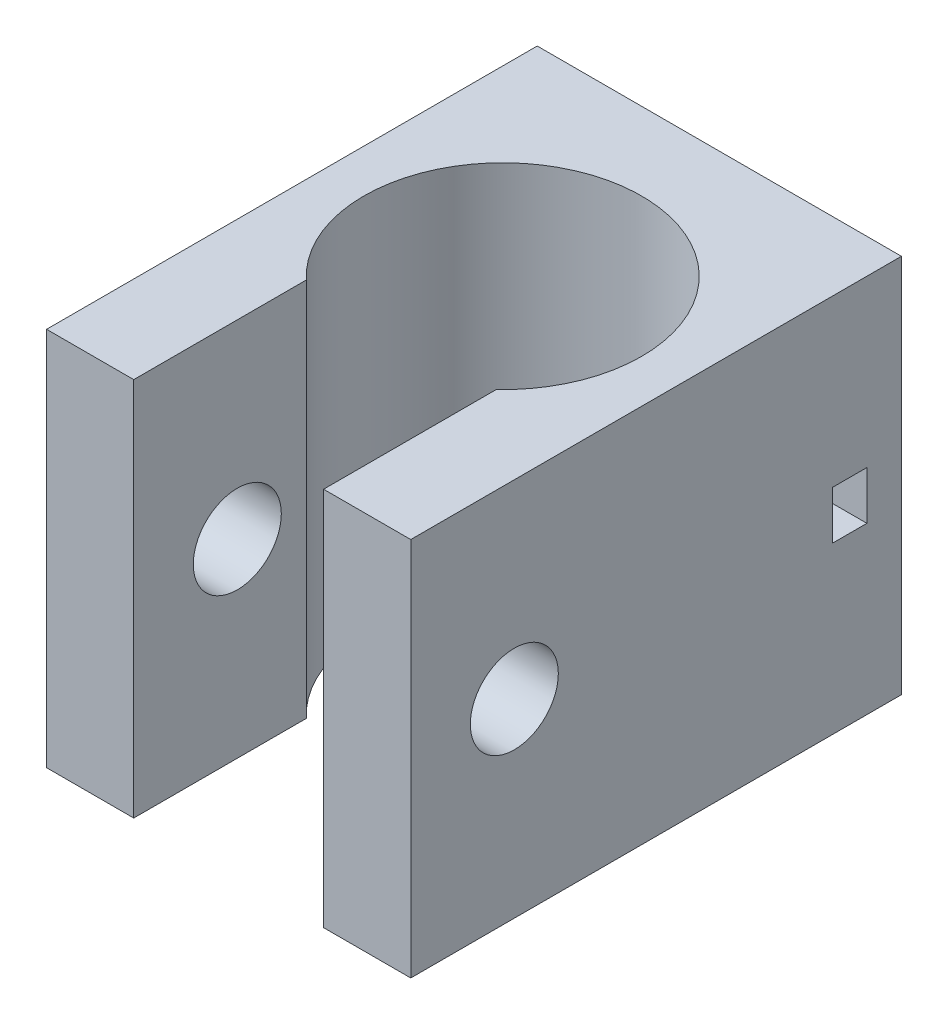
ISO-10303-21;
HEADER;
FILE_DESCRIPTION(('STEP AP214'),'2;1');
FILE_NAME('part.step','',(''),(''),'','','');
FILE_SCHEMA(('AUTOMOTIVE_DESIGN { 1 0 10303 214 1 1 1 1 }'));
ENDSEC;
DATA;
#1=APPLICATION_CONTEXT('core data for automotive mechanical design processes');
#2=APPLICATION_PROTOCOL_DEFINITION('international standard','automotive_design',2000,#1);
#3=PRODUCT_CONTEXT('',#1,'mechanical');
#4=PRODUCT('Part','Part','',(#3));
#5=PRODUCT_RELATED_PRODUCT_CATEGORY('part','',(#4));
#6=PRODUCT_DEFINITION_FORMATION('','',#4);
#7=PRODUCT_DEFINITION_CONTEXT('part definition',#1,'design');
#8=PRODUCT_DEFINITION('design','',#6,#7);
#9=PRODUCT_DEFINITION_SHAPE('','',#8);
#10=(LENGTH_UNIT() NAMED_UNIT(*) SI_UNIT(.MILLI.,.METRE.));
#11=(NAMED_UNIT(*) PLANE_ANGLE_UNIT() SI_UNIT($,.RADIAN.));
#12=(NAMED_UNIT(*) SI_UNIT($,.STERADIAN.) SOLID_ANGLE_UNIT());
#13=UNCERTAINTY_MEASURE_WITH_UNIT(LENGTH_MEASURE(1.E-05),#10,'distance_accuracy_value','');
#14=(GEOMETRIC_REPRESENTATION_CONTEXT(3) GLOBAL_UNCERTAINTY_ASSIGNED_CONTEXT((#13)) GLOBAL_UNIT_ASSIGNED_CONTEXT((#10,
#11,#12)) REPRESENTATION_CONTEXT('',''));
#15=CARTESIAN_POINT('',(0.,0.,0.));
#16=DIRECTION('',(0.,0.,1.));
#17=DIRECTION('',(1.,0.,0.));
#18=AXIS2_PLACEMENT_3D('',#15,#16,#17);
#19=CARTESIAN_POINT('',(-5.49999999999999,11.,15.));
#20=DIRECTION('',(-1.,0.,0.));
#21=DIRECTION('',(0.,0.,1.));
#22=AXIS2_PLACEMENT_3D('',#19,#20,#21);
#23=PLANE('',#22);
#24=CARTESIAN_POINT('',(-5.49999999999999,0.,9.));
#25=DIRECTION('',(-1.,0.,0.));
#26=DIRECTION('',(0.,0.,1.));
#27=AXIS2_PLACEMENT_3D('',#24,#25,#26);
#28=CIRCLE('',#27,2.55);
#29=CARTESIAN_POINT('',(-5.49999999999999,0.,11.55));
#30=VERTEX_POINT('',#29);
#31=EDGE_CURVE('E321',#30,#30,#28,.T.);
#32=ORIENTED_EDGE('',*,*,#31,.T.);
#33=EDGE_LOOP('',(#32));
#34=FACE_BOUND('',#33,.T.);
#35=DIRECTION('',(0.,0.,-1.));
#36=VECTOR('',#35,1.);
#37=CARTESIAN_POINT('',(-5.49999999999999,-11.,15.));
#38=LINE('',#37,#36);
#39=CARTESIAN_POINT('',(-5.49999999999999,-11.,15.));
#40=VERTEX_POINT('',#39);
#41=CARTESIAN_POINT('',(-5.49999999999999,-11.,5.));
#42=VERTEX_POINT('',#41);
#43=EDGE_CURVE('E325',#40,#42,#38,.T.);
#44=ORIENTED_EDGE('',*,*,#43,.T.);
#45=DIRECTION('',(0.,-1.,0.));
#46=VECTOR('',#45,1.);
#47=CARTESIAN_POINT('',(-5.49999999999999,11.,5.));
#48=LINE('',#47,#46);
#49=CARTESIAN_POINT('',(-5.49999999999999,11.,5.));
#50=VERTEX_POINT('',#49);
#51=EDGE_CURVE('E11',#50,#42,#48,.T.);
#52=ORIENTED_EDGE('',*,*,#51,.F.);
#53=DIRECTION('',(0.,0.,-1.));
#54=VECTOR('',#53,1.);
#55=CARTESIAN_POINT('',(-5.49999999999999,11.,15.));
#56=LINE('',#55,#54);
#57=CARTESIAN_POINT('',(-5.49999999999999,11.,15.));
#58=VERTEX_POINT('',#57);
#59=EDGE_CURVE('E326',#58,#50,#56,.T.);
#60=ORIENTED_EDGE('',*,*,#59,.F.);
#61=DIRECTION('',(0.,-1.,0.));
#62=VECTOR('',#61,1.);
#63=CARTESIAN_POINT('',(-5.49999999999999,11.,15.));
#64=LINE('',#63,#62);
#65=EDGE_CURVE('E352',#58,#40,#64,.T.);
#66=ORIENTED_EDGE('',*,*,#65,.T.);
#67=EDGE_LOOP('',(#44,#52,#60,#66));
#68=FACE_BOUND('',#67,.T.);
#69=ADVANCED_FACE('F39',(#34,#68),#23,.F.);
#70=CARTESIAN_POINT('',(0.,11.,-0.878137460114387));
#71=DIRECTION('',(0.,-1.,0.));
#72=DIRECTION('',(0.,0.,-1.));
#73=AXIS2_PLACEMENT_3D('',#70,#71,#72);
#74=CYLINDRICAL_SURFACE('',#73,8.05);
#75=CARTESIAN_POINT('',(0.,-11.,-0.878137460114387));
#76=DIRECTION('',(0.,-1.,0.));
#77=DIRECTION('',(0.,0.,-1.));
#78=AXIS2_PLACEMENT_3D('',#75,#76,#77);
#79=CIRCLE('',#78,8.05);
#80=CARTESIAN_POINT('',(5.50000000000001,-11.,5.));
#81=VERTEX_POINT('',#80);
#82=EDGE_CURVE('E356',#42,#81,#79,.T.);
#83=ORIENTED_EDGE('',*,*,#82,.T.);
#84=DIRECTION('',(0.,-1.,0.));
#85=VECTOR('',#84,1.);
#86=CARTESIAN_POINT('',(5.50000000000001,11.,5.));
#87=LINE('',#86,#85);
#88=CARTESIAN_POINT('',(5.50000000000001,11.,5.));
#89=VERTEX_POINT('',#88);
#90=EDGE_CURVE('E47',#89,#81,#87,.T.);
#91=ORIENTED_EDGE('',*,*,#90,.F.);
#92=CARTESIAN_POINT('',(0.,11.,-0.878137460114387));
#93=DIRECTION('',(0.,-1.,0.));
#94=DIRECTION('',(0.,0.,-1.));
#95=AXIS2_PLACEMENT_3D('',#92,#93,#94);
#96=CIRCLE('',#95,8.05);
#97=EDGE_CURVE('E330',#50,#89,#96,.T.);
#98=ORIENTED_EDGE('',*,*,#97,.F.);
#99=ORIENTED_EDGE('',*,*,#51,.T.);
#100=EDGE_LOOP('',(#83,#91,#98,#99));
#101=FACE_BOUND('',#100,.T.);
#102=ADVANCED_FACE('F427',(#101),#74,.F.);
#103=CARTESIAN_POINT('',(5.50000000000001,11.,15.));
#104=DIRECTION('',(1.,0.,0.));
#105=DIRECTION('',(0.,0.,-1.));
#106=AXIS2_PLACEMENT_3D('',#103,#104,#105);
#107=PLANE('',#106);
#108=CARTESIAN_POINT('',(5.50000000000001,0.,8.99999999999999));
#109=DIRECTION('',(1.,0.,0.));
#110=DIRECTION('',(0.,0.,-1.));
#111=AXIS2_PLACEMENT_3D('',#108,#109,#110);
#112=CIRCLE('',#111,2.55);
#113=CARTESIAN_POINT('',(5.50000000000001,0.,6.44999999999999));
#114=VERTEX_POINT('',#113);
#115=EDGE_CURVE('E317',#114,#114,#112,.T.);
#116=ORIENTED_EDGE('',*,*,#115,.T.);
#117=EDGE_LOOP('',(#116));
#118=FACE_BOUND('',#117,.T.);
#119=DIRECTION('',(0.,0.,1.));
#120=VECTOR('',#119,1.);
#121=CARTESIAN_POINT('',(5.50000000000001,-11.,15.));
#122=LINE('',#121,#120);
#123=CARTESIAN_POINT('',(5.50000000000001,-11.,15.));
#124=VERTEX_POINT('',#123);
#125=EDGE_CURVE('E359',#81,#124,#122,.T.);
#126=ORIENTED_EDGE('',*,*,#125,.T.);
#127=DIRECTION('',(0.,-1.,0.));
#128=VECTOR('',#127,1.);
#129=CARTESIAN_POINT('',(5.50000000000001,11.,15.));
#130=LINE('',#129,#128);
#131=CARTESIAN_POINT('',(5.50000000000001,11.,15.));
#132=VERTEX_POINT('',#131);
#133=EDGE_CURVE('E395',#132,#124,#130,.T.);
#134=ORIENTED_EDGE('',*,*,#133,.F.);
#135=DIRECTION('',(0.,0.,1.));
#136=VECTOR('',#135,1.);
#137=CARTESIAN_POINT('',(5.50000000000001,11.,15.));
#138=LINE('',#137,#136);
#139=EDGE_CURVE('E334',#89,#132,#138,.T.);
#140=ORIENTED_EDGE('',*,*,#139,.F.);
#141=ORIENTED_EDGE('',*,*,#90,.T.);
#142=EDGE_LOOP('',(#126,#134,#140,#141));
#143=FACE_BOUND('',#142,.T.);
#144=ADVANCED_FACE('F404',(#118,#143),#107,.F.);
#145=CARTESIAN_POINT('',(10.55,11.,15.));
#146=DIRECTION('',(0.,0.,-1.));
#147=DIRECTION('',(-1.,0.,0.));
#148=AXIS2_PLACEMENT_3D('',#145,#146,#147);
#149=PLANE('',#148);
#150=DIRECTION('',(1.,0.,0.));
#151=VECTOR('',#150,1.);
#152=CARTESIAN_POINT('',(10.55,-11.,15.));
#153=LINE('',#152,#151);
#154=CARTESIAN_POINT('',(10.55,-11.,15.));
#155=VERTEX_POINT('',#154);
#156=EDGE_CURVE('E362',#124,#155,#153,.T.);
#157=ORIENTED_EDGE('',*,*,#156,.T.);
#158=DIRECTION('',(0.,-1.,0.));
#159=VECTOR('',#158,1.);
#160=CARTESIAN_POINT('',(10.55,11.,15.));
#161=LINE('',#160,#159);
#162=CARTESIAN_POINT('',(10.55,11.,15.));
#163=VERTEX_POINT('',#162);
#164=EDGE_CURVE('E391',#163,#155,#161,.T.);
#165=ORIENTED_EDGE('',*,*,#164,.F.);
#166=DIRECTION('',(1.,0.,0.));
#167=VECTOR('',#166,1.);
#168=CARTESIAN_POINT('',(10.55,11.,15.));
#169=LINE('',#168,#167);
#170=EDGE_CURVE('E337',#132,#163,#169,.T.);
#171=ORIENTED_EDGE('',*,*,#170,.F.);
#172=ORIENTED_EDGE('',*,*,#133,.T.);
#173=EDGE_LOOP('',(#157,#165,#171,#172));
#174=FACE_BOUND('',#173,.T.);
#175=ADVANCED_FACE('F415',(#174),#149,.F.);
#176=CARTESIAN_POINT('',(10.55,11.,-13.4281374601144));
#177=DIRECTION('',(-1.,0.,0.));
#178=DIRECTION('',(0.,0.,1.));
#179=AXIS2_PLACEMENT_3D('',#176,#177,#178);
#180=PLANE('',#179);
#181=DIRECTION('',(0.,0.,-1.));
#182=VECTOR('',#181,1.);
#183=CARTESIAN_POINT('',(10.55,-1.4,-9.42813746011439));
#184=LINE('',#183,#182);
#185=CARTESIAN_POINT('',(10.55,-1.4,-9.42813746011438));
#186=VERTEX_POINT('',#185);
#187=CARTESIAN_POINT('',(10.55,-1.4,-11.4281374601144));
#188=VERTEX_POINT('',#187);
#189=EDGE_CURVE('E283',#186,#188,#184,.T.);
#190=ORIENTED_EDGE('',*,*,#189,.F.);
#191=DIRECTION('',(0.,-1.,0.));
#192=VECTOR('',#191,1.);
#193=CARTESIAN_POINT('',(10.55,1.4,-9.42813746011439));
#194=LINE('',#193,#192);
#195=CARTESIAN_POINT('',(10.55,1.4,-9.42813746011439));
#196=VERTEX_POINT('',#195);
#197=EDGE_CURVE('E222',#196,#186,#194,.T.);
#198=ORIENTED_EDGE('',*,*,#197,.F.);
#199=DIRECTION('',(0.,0.,1.));
#200=VECTOR('',#199,1.);
#201=CARTESIAN_POINT('',(10.55,1.4,-9.42813746011439));
#202=LINE('',#201,#200);
#203=CARTESIAN_POINT('',(10.55,1.4,-11.4281374601144));
#204=VERTEX_POINT('',#203);
#205=EDGE_CURVE('E291',#204,#196,#202,.T.);
#206=ORIENTED_EDGE('',*,*,#205,.F.);
#207=DIRECTION('',(0.,1.,0.));
#208=VECTOR('',#207,1.);
#209=CARTESIAN_POINT('',(10.55,1.4,-11.4281374601144));
#210=LINE('',#209,#208);
#211=EDGE_CURVE('E287',#188,#204,#210,.T.);
#212=ORIENTED_EDGE('',*,*,#211,.F.);
#213=EDGE_LOOP('',(#190,#198,#206,#212));
#214=FACE_BOUND('',#213,.T.);
#215=CARTESIAN_POINT('',(10.55,0.,8.99999999999999));
#216=DIRECTION('',(1.,0.,0.));
#217=DIRECTION('',(0.,0.,-1.));
#218=AXIS2_PLACEMENT_3D('',#215,#216,#217);
#219=CIRCLE('',#218,2.55);
#220=CARTESIAN_POINT('',(10.55,0.,6.44999999999999));
#221=VERTEX_POINT('',#220);
#222=EDGE_CURVE('E309',#221,#221,#219,.T.);
#223=ORIENTED_EDGE('',*,*,#222,.F.);
#224=EDGE_LOOP('',(#223));
#225=FACE_BOUND('',#224,.T.);
#226=DIRECTION('',(0.,0.,-1.));
#227=VECTOR('',#226,1.);
#228=CARTESIAN_POINT('',(10.55,-11.,-13.4281374601144));
#229=LINE('',#228,#227);
#230=CARTESIAN_POINT('',(10.55,-11.,-13.4281374601144));
#231=VERTEX_POINT('',#230);
#232=EDGE_CURVE('E365',#155,#231,#229,.T.);
#233=ORIENTED_EDGE('',*,*,#232,.T.);
#234=DIRECTION('',(0.,-1.,0.));
#235=VECTOR('',#234,1.);
#236=CARTESIAN_POINT('',(10.55,11.,-13.4281374601144));
#237=LINE('',#236,#235);
#238=CARTESIAN_POINT('',(10.55,11.,-13.4281374601144));
#239=VERTEX_POINT('',#238);
#240=EDGE_CURVE('E387',#239,#231,#237,.T.);
#241=ORIENTED_EDGE('',*,*,#240,.F.);
#242=DIRECTION('',(0.,0.,-1.));
#243=VECTOR('',#242,1.);
#244=CARTESIAN_POINT('',(10.55,11.,-13.4281374601144));
#245=LINE('',#244,#243);
#246=EDGE_CURVE('E340',#163,#239,#245,.T.);
#247=ORIENTED_EDGE('',*,*,#246,.F.);
#248=ORIENTED_EDGE('',*,*,#164,.T.);
#249=EDGE_LOOP('',(#233,#241,#247,#248));
#250=FACE_BOUND('',#249,.T.);
#251=ADVANCED_FACE('F419',(#214,#225,#250),#180,.F.);
#252=CARTESIAN_POINT('',(-10.55,11.,-13.4281374601144));
#253=DIRECTION('',(0.,0.,1.));
#254=DIRECTION('',(1.,0.,0.));
#255=AXIS2_PLACEMENT_3D('',#252,#253,#254);
#256=PLANE('',#255);
#257=DIRECTION('',(-1.,0.,0.));
#258=VECTOR('',#257,1.);
#259=CARTESIAN_POINT('',(2.50000000000001,3.5,-13.4281374601144));
#260=LINE('',#259,#258);
#261=CARTESIAN_POINT('',(2.50000000000001,3.5,-13.4281374601144));
#262=VERTEX_POINT('',#261);
#263=CARTESIAN_POINT('',(-2.49999999999999,3.5,-13.4281374601144));
#264=VERTEX_POINT('',#263);
#265=EDGE_CURVE('E212',#262,#264,#260,.T.);
#266=ORIENTED_EDGE('',*,*,#265,.F.);
#267=DIRECTION('',(0.,-1.,0.));
#268=VECTOR('',#267,1.);
#269=CARTESIAN_POINT('',(2.50000000000001,8.5,-13.4281374601144));
#270=LINE('',#269,#268);
#271=CARTESIAN_POINT('',(2.50000000000001,8.5,-13.4281374601144));
#272=VERTEX_POINT('',#271);
#273=EDGE_CURVE('E54',#272,#262,#270,.T.);
#274=ORIENTED_EDGE('',*,*,#273,.F.);
#275=DIRECTION('',(1.,0.,0.));
#276=VECTOR('',#275,1.);
#277=CARTESIAN_POINT('',(2.50000000000001,8.5,-13.4281374601144));
#278=LINE('',#277,#276);
#279=CARTESIAN_POINT('',(-2.49999999999999,8.5,-13.4281374601144));
#280=VERTEX_POINT('',#279);
#281=EDGE_CURVE('E199',#280,#272,#278,.T.);
#282=ORIENTED_EDGE('',*,*,#281,.F.);
#283=DIRECTION('',(0.,1.,0.));
#284=VECTOR('',#283,1.);
#285=CARTESIAN_POINT('',(-2.49999999999999,8.5,-13.4281374601144));
#286=LINE('',#285,#284);
#287=EDGE_CURVE('E203',#264,#280,#286,.T.);
#288=ORIENTED_EDGE('',*,*,#287,.F.);
#289=EDGE_LOOP('',(#266,#274,#282,#288));
#290=FACE_BOUND('',#289,.T.);
#291=DIRECTION('',(1.,0.,0.));
#292=VECTOR('',#291,1.);
#293=CARTESIAN_POINT('',(-2.49999999999999,-3.5,-13.4281374601144));
#294=LINE('',#293,#292);
#295=CARTESIAN_POINT('',(-2.49999999999999,-3.5,-13.4281374601144));
#296=VERTEX_POINT('',#295);
#297=CARTESIAN_POINT('',(2.50000000000001,-3.5,-13.4281374601144));
#298=VERTEX_POINT('',#297);
#299=EDGE_CURVE('E248',#296,#298,#294,.T.);
#300=ORIENTED_EDGE('',*,*,#299,.F.);
#301=DIRECTION('',(0.,1.,0.));
#302=VECTOR('',#301,1.);
#303=CARTESIAN_POINT('',(-2.49999999999999,-3.5,-13.4281374601144));
#304=LINE('',#303,#302);
#305=CARTESIAN_POINT('',(-2.49999999999999,-8.5,-13.4281374601144));
#306=VERTEX_POINT('',#305);
#307=EDGE_CURVE('E62',#306,#296,#304,.T.);
#308=ORIENTED_EDGE('',*,*,#307,.F.);
#309=DIRECTION('',(-1.,0.,0.));
#310=VECTOR('',#309,1.);
#311=CARTESIAN_POINT('',(-2.49999999999999,-8.5,-13.4281374601144));
#312=LINE('',#311,#310);
#313=CARTESIAN_POINT('',(2.50000000000001,-8.5,-13.4281374601144));
#314=VERTEX_POINT('',#313);
#315=EDGE_CURVE('E233',#314,#306,#312,.T.);
#316=ORIENTED_EDGE('',*,*,#315,.F.);
#317=DIRECTION('',(0.,-1.,0.));
#318=VECTOR('',#317,1.);
#319=CARTESIAN_POINT('',(2.50000000000001,-3.5,-13.4281374601144));
#320=LINE('',#319,#318);
#321=EDGE_CURVE('E252',#298,#314,#320,.T.);
#322=ORIENTED_EDGE('',*,*,#321,.F.);
#323=EDGE_LOOP('',(#300,#308,#316,#322));
#324=FACE_BOUND('',#323,.T.);
#325=DIRECTION('',(-1.,0.,0.));
#326=VECTOR('',#325,1.);
#327=CARTESIAN_POINT('',(-10.55,-11.,-13.4281374601144));
#328=LINE('',#327,#326);
#329=CARTESIAN_POINT('',(-10.55,-11.,-13.4281374601144));
#330=VERTEX_POINT('',#329);
#331=EDGE_CURVE('E368',#231,#330,#328,.T.);
#332=ORIENTED_EDGE('',*,*,#331,.T.);
#333=DIRECTION('',(0.,-1.,0.));
#334=VECTOR('',#333,1.);
#335=CARTESIAN_POINT('',(-10.55,11.,-13.4281374601144));
#336=LINE('',#335,#334);
#337=CARTESIAN_POINT('',(-10.55,11.,-13.4281374601144));
#338=VERTEX_POINT('',#337);
#339=EDGE_CURVE('E383',#338,#330,#336,.T.);
#340=ORIENTED_EDGE('',*,*,#339,.F.);
#341=DIRECTION('',(-1.,0.,0.));
#342=VECTOR('',#341,1.);
#343=CARTESIAN_POINT('',(-10.55,11.,-13.4281374601144));
#344=LINE('',#343,#342);
#345=EDGE_CURVE('E343',#239,#338,#344,.T.);
#346=ORIENTED_EDGE('',*,*,#345,.F.);
#347=ORIENTED_EDGE('',*,*,#240,.T.);
#348=EDGE_LOOP('',(#332,#340,#346,#347));
#349=FACE_BOUND('',#348,.T.);
#350=ADVANCED_FACE('F440',(#290,#324,#349),#256,.F.);
#351=CARTESIAN_POINT('',(-10.55,11.,15.));
#352=DIRECTION('',(1.,0.,0.));
#353=DIRECTION('',(0.,0.,-1.));
#354=AXIS2_PLACEMENT_3D('',#351,#352,#353);
#355=PLANE('',#354);
#356=DIRECTION('',(0.,0.,-1.));
#357=VECTOR('',#356,1.);
#358=CARTESIAN_POINT('',(-10.55,1.4,-9.42813746011438));
#359=LINE('',#358,#357);
#360=CARTESIAN_POINT('',(-10.55,1.4,-9.42813746011438));
#361=VERTEX_POINT('',#360);
#362=CARTESIAN_POINT('',(-10.55,1.4,-11.4281374601144));
#363=VERTEX_POINT('',#362);
#364=EDGE_CURVE('E273',#361,#363,#359,.T.);
#365=ORIENTED_EDGE('',*,*,#364,.F.);
#366=DIRECTION('',(0.,1.,0.));
#367=VECTOR('',#366,1.);
#368=CARTESIAN_POINT('',(-10.55,1.4,-9.42813746011438));
#369=LINE('',#368,#367);
#370=CARTESIAN_POINT('',(-10.55,-1.4,-9.42813746011438));
#371=VERTEX_POINT('',#370);
#372=EDGE_CURVE('E277',#371,#361,#369,.T.);
#373=ORIENTED_EDGE('',*,*,#372,.F.);
#374=DIRECTION('',(0.,0.,1.));
#375=VECTOR('',#374,1.);
#376=CARTESIAN_POINT('',(-10.55,-1.4,-9.42813746011438));
#377=LINE('',#376,#375);
#378=CARTESIAN_POINT('',(-10.55,-1.4,-11.4281374601144));
#379=VERTEX_POINT('',#378);
#380=EDGE_CURVE('E280',#379,#371,#377,.T.);
#381=ORIENTED_EDGE('',*,*,#380,.F.);
#382=DIRECTION('',(0.,-1.,0.));
#383=VECTOR('',#382,1.);
#384=CARTESIAN_POINT('',(-10.55,1.4,-11.4281374601144));
#385=LINE('',#384,#383);
#386=EDGE_CURVE('E269',#363,#379,#385,.T.);
#387=ORIENTED_EDGE('',*,*,#386,.F.);
#388=EDGE_LOOP('',(#365,#373,#381,#387));
#389=FACE_BOUND('',#388,.T.);
#390=CARTESIAN_POINT('',(-10.55,0.,9.));
#391=DIRECTION('',(1.,0.,0.));
#392=DIRECTION('',(0.,0.,-1.));
#393=AXIS2_PLACEMENT_3D('',#390,#391,#392);
#394=CIRCLE('',#393,2.55);
#395=CARTESIAN_POINT('',(-10.55,0.,6.44999999999999));
#396=VERTEX_POINT('',#395);
#397=EDGE_CURVE('E313',#396,#396,#394,.F.);
#398=ORIENTED_EDGE('',*,*,#397,.F.);
#399=EDGE_LOOP('',(#398));
#400=FACE_BOUND('',#399,.T.);
#401=DIRECTION('',(0.,0.,1.));
#402=VECTOR('',#401,1.);
#403=CARTESIAN_POINT('',(-10.55,-11.,15.));
#404=LINE('',#403,#402);
#405=CARTESIAN_POINT('',(-10.55,-11.,15.));
#406=VERTEX_POINT('',#405);
#407=EDGE_CURVE('E371',#330,#406,#404,.T.);
#408=ORIENTED_EDGE('',*,*,#407,.T.);
#409=DIRECTION('',(0.,-1.,0.));
#410=VECTOR('',#409,1.);
#411=CARTESIAN_POINT('',(-10.55,11.,15.));
#412=LINE('',#411,#410);
#413=CARTESIAN_POINT('',(-10.55,11.,15.));
#414=VERTEX_POINT('',#413);
#415=EDGE_CURVE('E379',#414,#406,#412,.T.);
#416=ORIENTED_EDGE('',*,*,#415,.F.);
#417=DIRECTION('',(0.,0.,1.));
#418=VECTOR('',#417,1.);
#419=CARTESIAN_POINT('',(-10.55,11.,15.));
#420=LINE('',#419,#418);
#421=EDGE_CURVE('E346',#338,#414,#420,.T.);
#422=ORIENTED_EDGE('',*,*,#421,.F.);
#423=ORIENTED_EDGE('',*,*,#339,.T.);
#424=EDGE_LOOP('',(#408,#416,#422,#423));
#425=FACE_BOUND('',#424,.T.);
#426=ADVANCED_FACE('F438',(#389,#400,#425),#355,.F.);
#427=CARTESIAN_POINT('',(-5.49999999999999,11.,15.));
#428=DIRECTION('',(0.,0.,-1.));
#429=DIRECTION('',(-1.,0.,0.));
#430=AXIS2_PLACEMENT_3D('',#427,#428,#429);
#431=PLANE('',#430);
#432=DIRECTION('',(1.,0.,0.));
#433=VECTOR('',#432,1.);
#434=CARTESIAN_POINT('',(-5.49999999999999,-11.,15.));
#435=LINE('',#434,#433);
#436=EDGE_CURVE('E331',#406,#40,#435,.T.);
#437=ORIENTED_EDGE('',*,*,#436,.T.);
#438=ORIENTED_EDGE('',*,*,#65,.F.);
#439=DIRECTION('',(1.,0.,0.));
#440=VECTOR('',#439,1.);
#441=CARTESIAN_POINT('',(-5.49999999999999,11.,15.));
#442=LINE('',#441,#440);
#443=EDGE_CURVE('E349',#414,#58,#442,.T.);
#444=ORIENTED_EDGE('',*,*,#443,.F.);
#445=ORIENTED_EDGE('',*,*,#415,.T.);
#446=EDGE_LOOP('',(#437,#438,#444,#445));
#447=FACE_BOUND('',#446,.T.);
#448=ADVANCED_FACE('F433',(#447),#431,.F.);
#449=CARTESIAN_POINT('',(0.,11.,-0.878137460114387));
#450=DIRECTION('',(0.,-1.,0.));
#451=DIRECTION('',(0.,0.,-1.));
#452=AXIS2_PLACEMENT_3D('',#449,#450,#451);
#453=PLANE('',#452);
#454=ORIENTED_EDGE('',*,*,#59,.T.);
#455=ORIENTED_EDGE('',*,*,#97,.T.);
#456=ORIENTED_EDGE('',*,*,#139,.T.);
#457=ORIENTED_EDGE('',*,*,#170,.T.);
#458=ORIENTED_EDGE('',*,*,#246,.T.);
#459=ORIENTED_EDGE('',*,*,#345,.T.);
#460=ORIENTED_EDGE('',*,*,#421,.T.);
#461=ORIENTED_EDGE('',*,*,#443,.T.);
#462=EDGE_LOOP('',(#454,#455,#456,#457,#458,#459,#460,#461));
#463=FACE_BOUND('',#462,.T.);
#464=ADVANCED_FACE('F423',(#463),#453,.F.);
#465=CARTESIAN_POINT('',(0.,-11.,-0.878137460114387));
#466=DIRECTION('',(0.,-1.,0.));
#467=DIRECTION('',(0.,0.,-1.));
#468=AXIS2_PLACEMENT_3D('',#465,#466,#467);
#469=PLANE('',#468);
#470=ORIENTED_EDGE('',*,*,#43,.F.);
#471=ORIENTED_EDGE('',*,*,#436,.F.);
#472=ORIENTED_EDGE('',*,*,#407,.F.);
#473=ORIENTED_EDGE('',*,*,#331,.F.);
#474=ORIENTED_EDGE('',*,*,#232,.F.);
#475=ORIENTED_EDGE('',*,*,#156,.F.);
#476=ORIENTED_EDGE('',*,*,#125,.F.);
#477=ORIENTED_EDGE('',*,*,#82,.F.);
#478=EDGE_LOOP('',(#470,#471,#472,#473,#474,#475,#476,#477));
#479=FACE_BOUND('',#478,.T.);
#480=ADVANCED_FACE('F410',(#479),#469,.T.);
#481=CARTESIAN_POINT('',(-17.7624891681028,0.,9.));
#482=DIRECTION('',(1.,0.,0.));
#483=DIRECTION('',(0.,0.,-1.));
#484=AXIS2_PLACEMENT_3D('',#481,#482,#483);
#485=CYLINDRICAL_SURFACE('',#484,2.55);
#486=ORIENTED_EDGE('',*,*,#397,.T.);
#487=EDGE_LOOP('',(#486));
#488=FACE_BOUND('',#487,.T.);
#489=ORIENTED_EDGE('',*,*,#31,.F.);
#490=EDGE_LOOP('',(#489));
#491=FACE_BOUND('',#490,.T.);
#492=ADVANCED_FACE('F460',(#488,#491),#485,.F.);
#493=ORIENTED_EDGE('',*,*,#222,.T.);
#494=EDGE_LOOP('',(#493));
#495=FACE_BOUND('',#494,.T.);
#496=ORIENTED_EDGE('',*,*,#115,.F.);
#497=EDGE_LOOP('',(#496));
#498=FACE_BOUND('',#497,.T.);
#499=ADVANCED_FACE('F462',(#495,#498),#485,.F.);
#500=CARTESIAN_POINT('',(-13.990930106817,1.4,-9.42813746011438));
#501=DIRECTION('',(0.,0.,1.));
#502=DIRECTION('',(1.,0.,0.));
#503=AXIS2_PLACEMENT_3D('',#500,#501,#502);
#504=PLANE('',#503);
#505=ORIENTED_EDGE('',*,*,#372,.T.);
#506=DIRECTION('',(1.,0.,0.));
#507=VECTOR('',#506,1.);
#508=CARTESIAN_POINT('',(-13.990930106817,1.4,-9.42813746011438));
#509=LINE('',#508,#507);
#510=EDGE_CURVE('E274',#361,#196,#509,.T.);
#511=ORIENTED_EDGE('',*,*,#510,.T.);
#512=ORIENTED_EDGE('',*,*,#197,.T.);
#513=DIRECTION('',(1.,0.,0.));
#514=VECTOR('',#513,1.);
#515=CARTESIAN_POINT('',(-13.990930106817,-1.4,-9.42813746011438));
#516=LINE('',#515,#514);
#517=EDGE_CURVE('E295',#371,#186,#516,.T.);
#518=ORIENTED_EDGE('',*,*,#517,.F.);
#519=EDGE_LOOP('',(#505,#511,#512,#518));
#520=FACE_BOUND('',#519,.T.);
#521=ADVANCED_FACE('F469',(#520),#504,.F.);
#522=CARTESIAN_POINT('',(-13.990930106817,1.4,-9.42813746011438));
#523=DIRECTION('',(0.,1.,0.));
#524=DIRECTION('',(0.,0.,1.));
#525=AXIS2_PLACEMENT_3D('',#522,#523,#524);
#526=PLANE('',#525);
#527=ORIENTED_EDGE('',*,*,#364,.T.);
#528=DIRECTION('',(1.,0.,0.));
#529=VECTOR('',#528,1.);
#530=CARTESIAN_POINT('',(-13.990930106817,1.4,-11.4281374601144));
#531=LINE('',#530,#529);
#532=EDGE_CURVE('E298',#363,#204,#531,.T.);
#533=ORIENTED_EDGE('',*,*,#532,.T.);
#534=ORIENTED_EDGE('',*,*,#205,.T.);
#535=ORIENTED_EDGE('',*,*,#510,.F.);
#536=EDGE_LOOP('',(#527,#533,#534,#535));
#537=FACE_BOUND('',#536,.T.);
#538=ADVANCED_FACE('F537',(#537),#526,.F.);
#539=CARTESIAN_POINT('',(-13.990930106817,1.4,-11.4281374601144));
#540=DIRECTION('',(0.,0.,-1.));
#541=DIRECTION('',(0.,1.,0.));
#542=AXIS2_PLACEMENT_3D('',#539,#540,#541);
#543=PLANE('',#542);
#544=ORIENTED_EDGE('',*,*,#386,.T.);
#545=DIRECTION('',(1.,0.,0.));
#546=VECTOR('',#545,1.);
#547=CARTESIAN_POINT('',(-13.990930106817,-1.4,-11.4281374601144));
#548=LINE('',#547,#546);
#549=EDGE_CURVE('E301',#379,#188,#548,.T.);
#550=ORIENTED_EDGE('',*,*,#549,.T.);
#551=ORIENTED_EDGE('',*,*,#211,.T.);
#552=ORIENTED_EDGE('',*,*,#532,.F.);
#553=EDGE_LOOP('',(#544,#550,#551,#552));
#554=FACE_BOUND('',#553,.T.);
#555=ADVANCED_FACE('F546',(#554),#543,.F.);
#556=CARTESIAN_POINT('',(-13.990930106817,-1.4,-9.42813746011438));
#557=DIRECTION('',(0.,-1.,0.));
#558=DIRECTION('',(0.,0.,-1.));
#559=AXIS2_PLACEMENT_3D('',#556,#557,#558);
#560=PLANE('',#559);
#561=ORIENTED_EDGE('',*,*,#380,.T.);
#562=ORIENTED_EDGE('',*,*,#517,.T.);
#563=ORIENTED_EDGE('',*,*,#189,.T.);
#564=ORIENTED_EDGE('',*,*,#549,.F.);
#565=EDGE_LOOP('',(#561,#562,#563,#564));
#566=FACE_BOUND('',#565,.T.);
#567=ADVANCED_FACE('F556',(#566),#560,.F.);
#568=CARTESIAN_POINT('',(-2.49999999999999,-3.5,-11.4281374601144));
#569=DIRECTION('',(-1.,0.,0.));
#570=DIRECTION('',(0.,-1.,0.));
#571=AXIS2_PLACEMENT_3D('',#568,#569,#570);
#572=PLANE('',#571);
#573=ORIENTED_EDGE('',*,*,#307,.T.);
#574=DIRECTION('',(0.,0.,-1.));
#575=VECTOR('',#574,1.);
#576=CARTESIAN_POINT('',(-2.49999999999999,-3.5,-11.4281374601144));
#577=LINE('',#576,#575);
#578=CARTESIAN_POINT('',(-2.49999999999999,-3.5,-11.4281374601144));
#579=VERTEX_POINT('',#578);
#580=EDGE_CURVE('E245',#579,#296,#577,.T.);
#581=ORIENTED_EDGE('',*,*,#580,.F.);
#582=DIRECTION('',(0.,1.,0.));
#583=VECTOR('',#582,1.);
#584=CARTESIAN_POINT('',(-2.49999999999999,-3.5,-11.4281374601144));
#585=LINE('',#584,#583);
#586=CARTESIAN_POINT('',(-2.49999999999999,-8.5,-11.4281374601144));
#587=VERTEX_POINT('',#586);
#588=EDGE_CURVE('E228',#587,#579,#585,.T.);
#589=ORIENTED_EDGE('',*,*,#588,.F.);
#590=DIRECTION('',(0.,0.,-1.));
#591=VECTOR('',#590,1.);
#592=CARTESIAN_POINT('',(-2.49999999999999,-8.5,-11.4281374601144));
#593=LINE('',#592,#591);
#594=EDGE_CURVE('E213',#587,#306,#593,.T.);
#595=ORIENTED_EDGE('',*,*,#594,.T.);
#596=EDGE_LOOP('',(#573,#581,#589,#595));
#597=FACE_BOUND('',#596,.T.);
#598=ADVANCED_FACE('F565',(#597),#572,.F.);
#599=CARTESIAN_POINT('',(-2.49999999999999,-8.5,-11.4281374601144));
#600=DIRECTION('',(0.,-1.,0.));
#601=DIRECTION('',(0.,0.,-1.));
#602=AXIS2_PLACEMENT_3D('',#599,#600,#601);
#603=PLANE('',#602);
#604=ORIENTED_EDGE('',*,*,#315,.T.);
#605=ORIENTED_EDGE('',*,*,#594,.F.);
#606=DIRECTION('',(-1.,0.,0.));
#607=VECTOR('',#606,1.);
#608=CARTESIAN_POINT('',(-2.49999999999999,-8.5,-11.4281374601144));
#609=LINE('',#608,#607);
#610=CARTESIAN_POINT('',(2.50000000000001,-8.5,-11.4281374601144));
#611=VERTEX_POINT('',#610);
#612=EDGE_CURVE('E241',#611,#587,#609,.T.);
#613=ORIENTED_EDGE('',*,*,#612,.F.);
#614=DIRECTION('',(0.,0.,-1.));
#615=VECTOR('',#614,1.);
#616=CARTESIAN_POINT('',(2.50000000000001,-8.5,-11.4281374601144));
#617=LINE('',#616,#615);
#618=EDGE_CURVE('E261',#611,#314,#617,.T.);
#619=ORIENTED_EDGE('',*,*,#618,.T.);
#620=EDGE_LOOP('',(#604,#605,#613,#619));
#621=FACE_BOUND('',#620,.T.);
#622=ADVANCED_FACE('F578',(#621),#603,.F.);
#623=CARTESIAN_POINT('',(2.50000000000001,-3.5,-11.4281374601144));
#624=DIRECTION('',(1.,0.,0.));
#625=DIRECTION('',(0.,1.,0.));
#626=AXIS2_PLACEMENT_3D('',#623,#624,#625);
#627=PLANE('',#626);
#628=ORIENTED_EDGE('',*,*,#321,.T.);
#629=ORIENTED_EDGE('',*,*,#618,.F.);
#630=DIRECTION('',(0.,-1.,0.));
#631=VECTOR('',#630,1.);
#632=CARTESIAN_POINT('',(2.50000000000001,-3.5,-11.4281374601144));
#633=LINE('',#632,#631);
#634=CARTESIAN_POINT('',(2.50000000000001,-3.5,-11.4281374601144));
#635=VERTEX_POINT('',#634);
#636=EDGE_CURVE('E237',#635,#611,#633,.T.);
#637=ORIENTED_EDGE('',*,*,#636,.F.);
#638=DIRECTION('',(0.,0.,-1.));
#639=VECTOR('',#638,1.);
#640=CARTESIAN_POINT('',(2.50000000000001,-3.5,-11.4281374601144));
#641=LINE('',#640,#639);
#642=EDGE_CURVE('E264',#635,#298,#641,.T.);
#643=ORIENTED_EDGE('',*,*,#642,.T.);
#644=EDGE_LOOP('',(#628,#629,#637,#643));
#645=FACE_BOUND('',#644,.T.);
#646=ADVANCED_FACE('F587',(#645),#627,.F.);
#647=CARTESIAN_POINT('',(-2.49999999999999,-3.5,-11.4281374601144));
#648=DIRECTION('',(0.,1.,0.));
#649=DIRECTION('',(-1.,0.,0.));
#650=AXIS2_PLACEMENT_3D('',#647,#648,#649);
#651=PLANE('',#650);
#652=ORIENTED_EDGE('',*,*,#299,.T.);
#653=ORIENTED_EDGE('',*,*,#642,.F.);
#654=DIRECTION('',(1.,0.,0.));
#655=VECTOR('',#654,1.);
#656=CARTESIAN_POINT('',(-2.49999999999999,-3.5,-11.4281374601144));
#657=LINE('',#656,#655);
#658=EDGE_CURVE('E232',#579,#635,#657,.T.);
#659=ORIENTED_EDGE('',*,*,#658,.F.);
#660=ORIENTED_EDGE('',*,*,#580,.T.);
#661=EDGE_LOOP('',(#652,#653,#659,#660));
#662=FACE_BOUND('',#661,.T.);
#663=ADVANCED_FACE('F597',(#662),#651,.F.);
#664=CARTESIAN_POINT('',(0.,0.,-11.4281374601144));
#665=DIRECTION('',(0.,0.,1.));
#666=DIRECTION('',(1.,0.,0.));
#667=AXIS2_PLACEMENT_3D('',#664,#665,#666);
#668=PLANE('',#667);
#669=ORIENTED_EDGE('',*,*,#588,.T.);
#670=ORIENTED_EDGE('',*,*,#658,.T.);
#671=ORIENTED_EDGE('',*,*,#636,.T.);
#672=ORIENTED_EDGE('',*,*,#612,.T.);
#673=EDGE_LOOP('',(#669,#670,#671,#672));
#674=FACE_BOUND('',#673,.T.);
#675=ADVANCED_FACE('F607',(#674),#668,.F.);
#676=CARTESIAN_POINT('',(2.50000000000001,8.5,-11.4281374601144));
#677=DIRECTION('',(1.,0.,0.));
#678=DIRECTION('',(0.,1.,0.));
#679=AXIS2_PLACEMENT_3D('',#676,#677,#678);
#680=PLANE('',#679);
#681=ORIENTED_EDGE('',*,*,#273,.T.);
#682=DIRECTION('',(0.,0.,-1.));
#683=VECTOR('',#682,1.);
#684=CARTESIAN_POINT('',(2.50000000000001,3.5,-11.4281374601144));
#685=LINE('',#684,#683);
#686=CARTESIAN_POINT('',(2.50000000000001,3.5,-11.4281374601144));
#687=VERTEX_POINT('',#686);
#688=EDGE_CURVE('E174',#687,#262,#685,.T.);
#689=ORIENTED_EDGE('',*,*,#688,.F.);
#690=DIRECTION('',(0.,-1.,0.));
#691=VECTOR('',#690,1.);
#692=CARTESIAN_POINT('',(2.50000000000001,8.5,-11.4281374601144));
#693=LINE('',#692,#691);
#694=CARTESIAN_POINT('',(2.50000000000001,8.5,-11.4281374601144));
#695=VERTEX_POINT('',#694);
#696=EDGE_CURVE('E178',#695,#687,#693,.T.);
#697=ORIENTED_EDGE('',*,*,#696,.F.);
#698=DIRECTION('',(0.,0.,-1.));
#699=VECTOR('',#698,1.);
#700=CARTESIAN_POINT('',(2.50000000000001,8.5,-11.4281374601144));
#701=LINE('',#700,#699);
#702=EDGE_CURVE('E219',#695,#272,#701,.T.);
#703=ORIENTED_EDGE('',*,*,#702,.T.);
#704=EDGE_LOOP('',(#681,#689,#697,#703));
#705=FACE_BOUND('',#704,.T.);
#706=ADVANCED_FACE('F176',(#705),#680,.F.);
#707=CARTESIAN_POINT('',(2.50000000000001,8.5,-11.4281374601144));
#708=DIRECTION('',(0.,1.,0.));
#709=DIRECTION('',(0.,0.,1.));
#710=AXIS2_PLACEMENT_3D('',#707,#708,#709);
#711=PLANE('',#710);
#712=ORIENTED_EDGE('',*,*,#281,.T.);
#713=ORIENTED_EDGE('',*,*,#702,.F.);
#714=DIRECTION('',(1.,0.,0.));
#715=VECTOR('',#714,1.);
#716=CARTESIAN_POINT('',(2.50000000000001,8.5,-11.4281374601144));
#717=LINE('',#716,#715);
#718=CARTESIAN_POINT('',(-2.49999999999999,8.5,-11.4281374601144));
#719=VERTEX_POINT('',#718);
#720=EDGE_CURVE('E185',#719,#695,#717,.T.);
#721=ORIENTED_EDGE('',*,*,#720,.F.);
#722=DIRECTION('',(0.,0.,-1.));
#723=VECTOR('',#722,1.);
#724=CARTESIAN_POINT('',(-2.49999999999999,8.5,-11.4281374601144));
#725=LINE('',#724,#723);
#726=EDGE_CURVE('E223',#719,#280,#725,.T.);
#727=ORIENTED_EDGE('',*,*,#726,.T.);
#728=EDGE_LOOP('',(#712,#713,#721,#727));
#729=FACE_BOUND('',#728,.T.);
#730=ADVANCED_FACE('F626',(#729),#711,.F.);
#731=CARTESIAN_POINT('',(-2.49999999999999,8.5,-11.4281374601144));
#732=DIRECTION('',(-1.,0.,0.));
#733=DIRECTION('',(0.,-1.,0.));
#734=AXIS2_PLACEMENT_3D('',#731,#732,#733);
#735=PLANE('',#734);
#736=ORIENTED_EDGE('',*,*,#287,.T.);
#737=ORIENTED_EDGE('',*,*,#726,.F.);
#738=DIRECTION('',(0.,1.,0.));
#739=VECTOR('',#738,1.);
#740=CARTESIAN_POINT('',(-2.49999999999999,8.5,-11.4281374601144));
#741=LINE('',#740,#739);
#742=CARTESIAN_POINT('',(-2.49999999999999,3.5,-11.4281374601144));
#743=VERTEX_POINT('',#742);
#744=EDGE_CURVE('E194',#743,#719,#741,.T.);
#745=ORIENTED_EDGE('',*,*,#744,.F.);
#746=DIRECTION('',(0.,0.,-1.));
#747=VECTOR('',#746,1.);
#748=CARTESIAN_POINT('',(-2.49999999999999,3.5,-11.4281374601144));
#749=LINE('',#748,#747);
#750=EDGE_CURVE('E184',#743,#264,#749,.T.);
#751=ORIENTED_EDGE('',*,*,#750,.T.);
#752=EDGE_LOOP('',(#736,#737,#745,#751));
#753=FACE_BOUND('',#752,.T.);
#754=ADVANCED_FACE('F635',(#753),#735,.F.);
#755=CARTESIAN_POINT('',(2.50000000000001,3.5,-11.4281374601144));
#756=DIRECTION('',(0.,-1.,0.));
#757=DIRECTION('',(0.,0.,-1.));
#758=AXIS2_PLACEMENT_3D('',#755,#756,#757);
#759=PLANE('',#758);
#760=ORIENTED_EDGE('',*,*,#265,.T.);
#761=ORIENTED_EDGE('',*,*,#750,.F.);
#762=DIRECTION('',(-1.,0.,0.));
#763=VECTOR('',#762,1.);
#764=CARTESIAN_POINT('',(2.50000000000001,3.5,-11.4281374601144));
#765=LINE('',#764,#763);
#766=EDGE_CURVE('E188',#687,#743,#765,.T.);
#767=ORIENTED_EDGE('',*,*,#766,.F.);
#768=ORIENTED_EDGE('',*,*,#688,.T.);
#769=EDGE_LOOP('',(#760,#761,#767,#768));
#770=FACE_BOUND('',#769,.T.);
#771=ADVANCED_FACE('F189',(#770),#759,.F.);
#772=CARTESIAN_POINT('',(0.,0.,-11.4281374601144));
#773=DIRECTION('',(0.,0.,-1.));
#774=DIRECTION('',(-1.,0.,0.));
#775=AXIS2_PLACEMENT_3D('',#772,#773,#774);
#776=PLANE('',#775);
#777=ORIENTED_EDGE('',*,*,#696,.T.);
#778=ORIENTED_EDGE('',*,*,#766,.T.);
#779=ORIENTED_EDGE('',*,*,#744,.T.);
#780=ORIENTED_EDGE('',*,*,#720,.T.);
#781=EDGE_LOOP('',(#777,#778,#779,#780));
#782=FACE_BOUND('',#781,.T.);
#783=ADVANCED_FACE('F196',(#782),#776,.T.);
#784=CLOSED_SHELL('',(#69,#102,#144,#175,#251,#350,#426,#448,#464,#480,#492,#499,#521,#538,#555,
#567,#598,#622,#646,#663,#675,#706,#730,#754,#771,#783));
#785=MANIFOLD_SOLID_BREP('B2',#784);
#786=ADVANCED_BREP_SHAPE_REPRESENTATION('',(#18,#785),#14);
#787=SHAPE_DEFINITION_REPRESENTATION(#9,#786);
ENDSEC;
END-ISO-10303-21;
